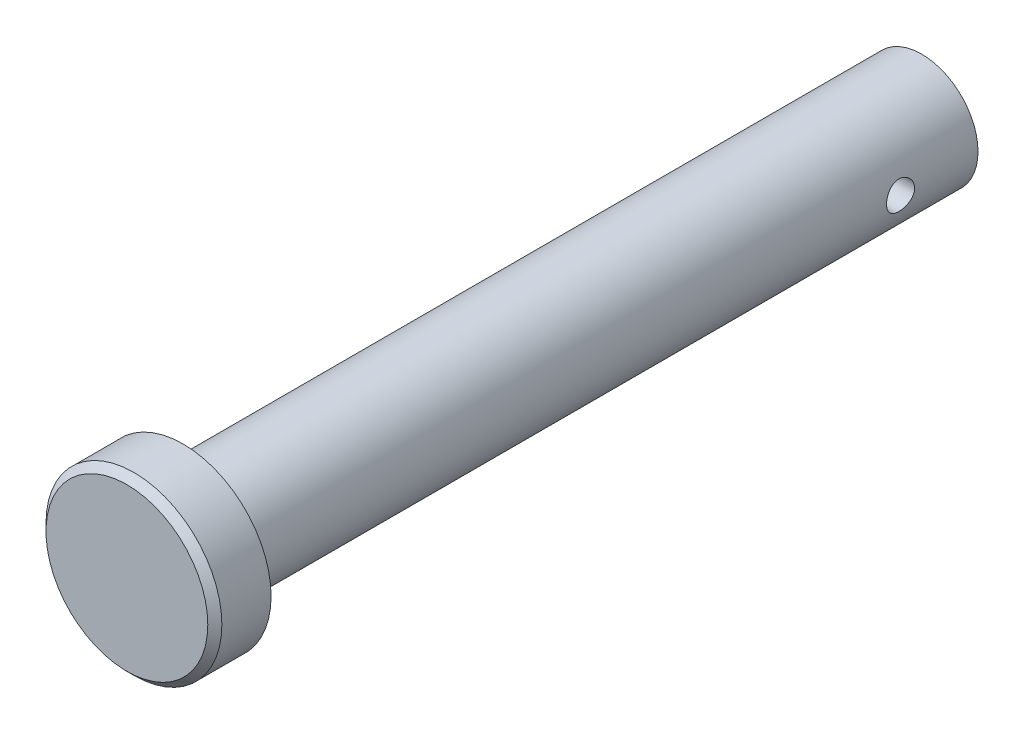
ISO-10303-21;
HEADER;
FILE_DESCRIPTION(('STEP AP214'),'2;1');
FILE_NAME('part.step','',(''),(''),'','','');
FILE_SCHEMA(('AUTOMOTIVE_DESIGN { 1 0 10303 214 1 1 1 1 }'));
ENDSEC;
DATA;
#1=APPLICATION_CONTEXT('core data for automotive mechanical design processes');
#2=APPLICATION_PROTOCOL_DEFINITION('international standard','automotive_design',2000,#1);
#3=PRODUCT_CONTEXT('',#1,'mechanical');
#4=PRODUCT('Part','Part','',(#3));
#5=PRODUCT_RELATED_PRODUCT_CATEGORY('part','',(#4));
#6=PRODUCT_DEFINITION_FORMATION('','',#4);
#7=PRODUCT_DEFINITION_CONTEXT('part definition',#1,'design');
#8=PRODUCT_DEFINITION('design','',#6,#7);
#9=PRODUCT_DEFINITION_SHAPE('','',#8);
#10=(LENGTH_UNIT() NAMED_UNIT(*) SI_UNIT(.MILLI.,.METRE.));
#11=(NAMED_UNIT(*) PLANE_ANGLE_UNIT() SI_UNIT($,.RADIAN.));
#12=(NAMED_UNIT(*) SI_UNIT($,.STERADIAN.) SOLID_ANGLE_UNIT());
#13=UNCERTAINTY_MEASURE_WITH_UNIT(LENGTH_MEASURE(1.E-05),#10,'distance_accuracy_value','');
#14=(GEOMETRIC_REPRESENTATION_CONTEXT(3) GLOBAL_UNCERTAINTY_ASSIGNED_CONTEXT((#13)) GLOBAL_UNIT_ASSIGNED_CONTEXT((#10,
#11,#12)) REPRESENTATION_CONTEXT('',''));
#15=CARTESIAN_POINT('',(0.,0.,0.));
#16=DIRECTION('',(0.,0.,1.));
#17=DIRECTION('',(1.,0.,0.));
#18=AXIS2_PLACEMENT_3D('',#15,#16,#17);
#19=CARTESIAN_POINT('',(0.,0.,105.));
#20=DIRECTION('',(0.,0.,-1.));
#21=DIRECTION('',(-1.,0.,0.));
#22=AXIS2_PLACEMENT_3D('',#19,#20,#21);
#23=CYLINDRICAL_SURFACE('',#22,8.);
#24=CARTESIAN_POINT('',(-8.,0.,13.));
#25=CARTESIAN_POINT('',(-7.9999981315735,-0.110501451559642,12.9999968990158));
#26=CARTESIAN_POINT('',(-7.99768770842435,-0.221037543774351,12.9908112656349));
#27=CARTESIAN_POINT('',(-7.98869485106526,-0.438941765027377,12.954366464924));
#28=CARTESIAN_POINT('',(-7.98200993893301,-0.54630806249432,12.9270970539495));
#29=CARTESIAN_POINT('',(-7.96500835109376,-0.754694496243437,12.8554143287172));
#30=CARTESIAN_POINT('',(-7.95469603789411,-0.855722084573338,12.811021601713));
#31=CARTESIAN_POINT('',(-7.93153791743495,-1.04889617587257,12.7064248132735));
#32=CARTESIAN_POINT('',(-7.91869202472208,-1.14104237913169,12.646220218508));
#33=CARTESIAN_POINT('',(-7.89156551455591,-1.31573590306789,12.5103989471278));
#34=CARTESIAN_POINT('',(-7.87726276197502,-1.39807425341474,12.4345179000546));
#35=CARTESIAN_POINT('',(-7.84898160157248,-1.54899856960443,12.270063726788));
#36=CARTESIAN_POINT('',(-7.83500323053157,-1.61758298259892,12.1814891694041));
#37=CARTESIAN_POINT('',(-7.80873034264225,-1.74003539039863,11.992539697684));
#38=CARTESIAN_POINT('',(-7.79646392619748,-1.79366962123352,11.8920090255884));
#39=CARTESIAN_POINT('',(-7.77532659757355,-1.88319587806766,11.6830021177866));
#40=CARTESIAN_POINT('',(-7.76645514259225,-1.91909074058686,11.5745271555573));
#41=CARTESIAN_POINT('',(-7.7533396892843,-1.97140644907302,11.3550086690644));
#42=CARTESIAN_POINT('',(-7.74900654662681,-1.98820302444274,11.244060138616));
#43=CARTESIAN_POINT('',(-7.74519149946122,-2.00301570008855,11.0208419080009));
#44=CARTESIAN_POINT('',(-7.74570880570571,-2.00103485575749,10.9085724257438));
#45=CARTESIAN_POINT('',(-7.75145607355756,-1.97864869951961,10.6887789230062));
#46=CARTESIAN_POINT('',(-7.75657150676391,-1.95869112025418,10.5812058380462));
#47=CARTESIAN_POINT('',(-7.77075612894758,-1.90163224920399,10.3709852654519));
#48=CARTESIAN_POINT('',(-7.77982559958985,-1.86452973609253,10.2683381292948));
#49=CARTESIAN_POINT('',(-7.80100151874212,-1.77385263724958,10.0696826449972));
#50=CARTESIAN_POINT('',(-7.81313769959755,-1.72011555631056,9.97375177094723));
#51=CARTESIAN_POINT('',(-7.83906281127988,-1.59780836801993,9.7921083869909));
#52=CARTESIAN_POINT('',(-7.85285203112837,-1.52923566507845,9.70639766924366));
#53=CARTESIAN_POINT('',(-7.88101174053188,-1.37688456624163,9.54506184574079));
#54=CARTESIAN_POINT('',(-7.89538759304001,-1.29272834422115,9.46979401325153));
#55=CARTESIAN_POINT('',(-7.92274620771675,-1.11281589000493,9.33437167671479));
#56=CARTESIAN_POINT('',(-7.93572892732543,-1.01705930361059,9.27421763431524));
#57=CARTESIAN_POINT('',(-7.9589030945892,-0.816154518241856,9.17059921836748));
#58=CARTESIAN_POINT('',(-7.96908480170303,-0.710975190944831,9.12719287966076));
#59=CARTESIAN_POINT('',(-7.98543889321888,-0.49450134419051,9.05877692572056));
#60=CARTESIAN_POINT('',(-7.99161204452374,-0.383207998867313,9.03376379144248));
#61=CARTESIAN_POINT('',(-7.999139990285,-0.160719960520035,9.00338991258821));
#62=CARTESIAN_POINT('',(-8.00061404677705,-0.0495956266509458,8.99754263189959));
#63=CARTESIAN_POINT('',(-7.99891739752601,0.172043833068678,9.00433200274064));
#64=CARTESIAN_POINT('',(-7.99574710989128,0.28255901285946,9.01696699039884));
#65=CARTESIAN_POINT('',(-7.98519441503143,0.498152358368656,9.0599612111885));
#66=CARTESIAN_POINT('',(-7.97787512247748,0.603286825291673,9.09005501796931));
#67=CARTESIAN_POINT('',(-7.95984942178845,0.807009723270016,9.16680944537126));
#68=CARTESIAN_POINT('',(-7.94914267159856,0.905597492043513,9.21347173908422));
#69=CARTESIAN_POINT('',(-7.92524410568414,1.0953641792398,9.3229815051663));
#70=CARTESIAN_POINT('',(-7.91201156489243,1.18638058911444,9.38610148319568));
#71=CARTESIAN_POINT('',(-7.88459345583226,1.35670215152433,9.52638654506262));
#72=CARTESIAN_POINT('',(-7.87040772335606,1.43600527863068,9.60355405282254));
#73=CARTESIAN_POINT('',(-7.84225275947695,1.58265409076364,9.77200261445928));
#74=CARTESIAN_POINT('',(-7.82829738916375,1.64965849016271,9.86358360400322));
#75=CARTESIAN_POINT('',(-7.80257171169652,1.7673476786836,10.0569768459543));
#76=CARTESIAN_POINT('',(-7.79080130756035,1.81803319221058,10.1587886439463));
#77=CARTESIAN_POINT('',(-7.77090792979553,1.90126856081239,10.3692076298841));
#78=CARTESIAN_POINT('',(-7.76276340389207,1.93392586220542,10.4777701711253));
#79=CARTESIAN_POINT('',(-7.75102325453578,1.98046087993837,10.6990795171855));
#80=CARTESIAN_POINT('',(-7.74742663626581,1.99434270330488,10.8118254013766));
#81=CARTESIAN_POINT('',(-7.74526534938609,2.00271812044533,11.0348280318069));
#82=CARTESIAN_POINT('',(-7.74655910304351,1.99775719704016,11.145063246833));
#83=CARTESIAN_POINT('',(-7.7537054534379,1.96983637108383,11.3630718515573));
#84=CARTESIAN_POINT('',(-7.75955795855809,1.94687683024903,11.4708452906849));
#85=CARTESIAN_POINT('',(-7.77508347576963,1.88390842592373,11.6802779454205));
#86=CARTESIAN_POINT('',(-7.78473353648412,1.84400187290717,11.7819697403203));
#87=CARTESIAN_POINT('',(-7.80677007633105,1.7483532181401,11.9772871769516));
#88=CARTESIAN_POINT('',(-7.81915693494364,1.69260892004559,12.0709116975826));
#89=CARTESIAN_POINT('',(-7.84567512351349,1.56515699818285,12.2500728386694));
#90=CARTESIAN_POINT('',(-7.85984353109009,1.49307088388301,12.3353347645653));
#91=CARTESIAN_POINT('',(-7.88810702995047,1.33571916158632,12.4927293930605));
#92=CARTESIAN_POINT('',(-7.90220210302746,1.2504504283482,12.564858973484));
#93=CARTESIAN_POINT('',(-7.92903540863551,1.06729011560346,12.6952150780861));
#94=CARTESIAN_POINT('',(-7.94174444487824,0.969197896421852,12.7531661515621));
#95=CARTESIAN_POINT('',(-7.96406566633491,0.76435474601397,12.8516632839207));
#96=CARTESIAN_POINT('',(-7.97368006933042,0.657610084582321,12.892221814198));
#97=CARTESIAN_POINT('',(-7.98730746087389,0.459213670991297,12.9487624404395));
#98=CARTESIAN_POINT('',(-7.9920344673692,0.368506894544093,12.9679349907379));
#99=CARTESIAN_POINT('',(-7.99838140309264,0.185208095381712,12.9935545914959));
#100=CARTESIAN_POINT('',(-8.00000156601192,0.0926162149901555,13.0000025990737));
#101=CARTESIAN_POINT('',(-8.,0.,13.));
#102=B_SPLINE_CURVE_WITH_KNOTS('',3,(#24,#25,#26,#27,#28,#29,#30,#31,#32,#33,#34,#35,#36,#37,
#38,#39,#40,#41,#42,#43,#44,#45,#46,#47,#48,#49,#50,#51,#52,#53,#54,#55,#56,#57,#58,#59,#60,#61,
#62,#63,#64,#65,#66,#67,#68,#69,#70,#71,#72,#73,#74,#75,#76,#77,#78,#79,#80,#81,#82,#83,#84,#85,
#86,#87,#88,#89,#90,#91,#92,#93,#94,#95,#96,#97,#98,#99,#100,#101),.UNSPECIFIED.,.T.,.F.,(4,2,2,
2,2,2,2,2,2,2,2,2,2,2,2,2,2,2,2,2,2,2,2,2,2,2,2,2,2,2,2,2,2,2,2,2,2,2,4),(0.,0.33116494996252,
0.662517650351867,0.993473203048143,1.32443992022577,1.66152580582852,1.99864972773416,
2.34078196727743,2.68285948225825,3.01808393468094,3.35325384154691,3.68029996013785,
4.00736937959146,4.337740371696,4.66816921119312,5.00802001296454,5.34788119415425,
5.6889097201658,6.02987298255952,6.36211078603464,6.69431868154752,7.02160366023145,
7.34892169767482,7.68204783424898,8.01523150681787,8.35659345610397,8.69794025003773,
9.03723006156477,9.37644564340973,9.70591707202579,10.0353818794581,10.3628853408369,
10.6904342418696,11.0265276855098,11.3627009303165,11.7049624733721,12.046978184329,
12.3245632392729,12.6021274139515),.UNSPECIFIED.);
#103=CARTESIAN_POINT('',(-8.,0.,13.));
#104=VERTEX_POINT('',#103);
#105=EDGE_CURVE('E44',#104,#104,#102,.T.);
#106=ORIENTED_EDGE('',*,*,#105,.T.);
#107=EDGE_LOOP('',(#106));
#108=FACE_BOUND('',#107,.T.);
#109=CARTESIAN_POINT('',(8.,0.,8.99999999999999));
#110=CARTESIAN_POINT('',(7.9999981315735,-0.110501451559642,9.0000031009842));
#111=CARTESIAN_POINT('',(7.99768770842435,-0.221037543774351,9.00918873436504));
#112=CARTESIAN_POINT('',(7.98869485106526,-0.438941765027377,9.045633535076));
#113=CARTESIAN_POINT('',(7.98200993893301,-0.54630806249432,9.07290294605046));
#114=CARTESIAN_POINT('',(7.96500835109376,-0.754694496243437,9.14458567128277));
#115=CARTESIAN_POINT('',(7.95469603789411,-0.855722084573338,9.18897839828702));
#116=CARTESIAN_POINT('',(7.93153791743495,-1.04889617587257,9.29357518672645));
#117=CARTESIAN_POINT('',(7.91869202472208,-1.14104237913169,9.35377978149195));
#118=CARTESIAN_POINT('',(7.89156551455591,-1.31573590306789,9.48960105287223));
#119=CARTESIAN_POINT('',(7.87726276197502,-1.39807425341474,9.56548209994541));
#120=CARTESIAN_POINT('',(7.84898160157248,-1.54899856960443,9.72993627321204));
#121=CARTESIAN_POINT('',(7.83500323053157,-1.61758298259892,9.81851083059591));
#122=CARTESIAN_POINT('',(7.80873034264225,-1.74003539039863,10.007460302316));
#123=CARTESIAN_POINT('',(7.79646392619748,-1.79366962123352,10.1079909744116));
#124=CARTESIAN_POINT('',(7.77532659757355,-1.88319587806766,10.3169978822134));
#125=CARTESIAN_POINT('',(7.76645514259225,-1.91909074058686,10.4254728444427));
#126=CARTESIAN_POINT('',(7.7533396892843,-1.97140644907302,10.6449913309355));
#127=CARTESIAN_POINT('',(7.74900654662681,-1.98820302444274,10.755939861384));
#128=CARTESIAN_POINT('',(7.74519149946122,-2.00301570008855,10.9791580919991));
#129=CARTESIAN_POINT('',(7.74570880570571,-2.00103485575749,11.0914275742562));
#130=CARTESIAN_POINT('',(7.75145607355756,-1.97864869951961,11.3112210769938));
#131=CARTESIAN_POINT('',(7.75657150676391,-1.95869112025418,11.4187941619538));
#132=CARTESIAN_POINT('',(7.77075612894758,-1.90163224920399,11.6290147345481));
#133=CARTESIAN_POINT('',(7.77982559958985,-1.86452973609253,11.7316618707052));
#134=CARTESIAN_POINT('',(7.80100151874212,-1.77385263724958,11.9303173550028));
#135=CARTESIAN_POINT('',(7.81313769959755,-1.72011555631056,12.0262482290528));
#136=CARTESIAN_POINT('',(7.83906281127988,-1.59780836801993,12.2078916130091));
#137=CARTESIAN_POINT('',(7.85285203112837,-1.52923566507845,12.2936023307563));
#138=CARTESIAN_POINT('',(7.88101174053188,-1.37688456624163,12.4549381542592));
#139=CARTESIAN_POINT('',(7.89538759304001,-1.29272834422115,12.5302059867485));
#140=CARTESIAN_POINT('',(7.92274620771675,-1.11281589000493,12.6656283232852));
#141=CARTESIAN_POINT('',(7.93572892732543,-1.01705930361059,12.7257823656848));
#142=CARTESIAN_POINT('',(7.9589030945892,-0.816154518241856,12.8294007816325));
#143=CARTESIAN_POINT('',(7.96908480170303,-0.710975190944831,12.8728071203392));
#144=CARTESIAN_POINT('',(7.98543889321888,-0.49450134419051,12.9412230742794));
#145=CARTESIAN_POINT('',(7.99161204452374,-0.383207998867313,12.9662362085575));
#146=CARTESIAN_POINT('',(7.999139990285,-0.160719960520035,12.9966100874118));
#147=CARTESIAN_POINT('',(8.00061404677705,-0.0495956266509458,13.0024573681004));
#148=CARTESIAN_POINT('',(7.99891739752601,0.172043833068678,12.9956679972593));
#149=CARTESIAN_POINT('',(7.99574710989128,0.28255901285946,12.9830330096012));
#150=CARTESIAN_POINT('',(7.98519441503143,0.498152358368656,12.9400387888115));
#151=CARTESIAN_POINT('',(7.97787512247748,0.603286825291674,12.9099449820307));
#152=CARTESIAN_POINT('',(7.95984942178845,0.807009723270016,12.8331905546287));
#153=CARTESIAN_POINT('',(7.94914267159856,0.905597492043513,12.7865282609158));
#154=CARTESIAN_POINT('',(7.92524410568414,1.0953641792398,12.6770184948337));
#155=CARTESIAN_POINT('',(7.91201156489243,1.18638058911444,12.6138985168043));
#156=CARTESIAN_POINT('',(7.88459345583226,1.35670215152433,12.4736134549374));
#157=CARTESIAN_POINT('',(7.87040772335606,1.43600527863068,12.3964459471775));
#158=CARTESIAN_POINT('',(7.84225275947695,1.58265409076364,12.2279973855407));
#159=CARTESIAN_POINT('',(7.82829738916375,1.64965849016271,12.1364163959968));
#160=CARTESIAN_POINT('',(7.80257171169652,1.7673476786836,11.9430231540457));
#161=CARTESIAN_POINT('',(7.79080130756035,1.81803319221058,11.8412113560537));
#162=CARTESIAN_POINT('',(7.77090792979553,1.90126856081239,11.6307923701159));
#163=CARTESIAN_POINT('',(7.76276340389207,1.93392586220542,11.5222298288747));
#164=CARTESIAN_POINT('',(7.75102325453578,1.98046087993837,11.3009204828145));
#165=CARTESIAN_POINT('',(7.74742663626581,1.99434270330488,11.1881745986233));
#166=CARTESIAN_POINT('',(7.74526534938609,2.00271812044533,10.9651719681931));
#167=CARTESIAN_POINT('',(7.74655910304351,1.99775719704016,10.854936753167));
#168=CARTESIAN_POINT('',(7.7537054534379,1.96983637108383,10.6369281484427));
#169=CARTESIAN_POINT('',(7.75955795855809,1.94687683024903,10.5291547093151));
#170=CARTESIAN_POINT('',(7.77508347576963,1.88390842592373,10.3197220545795));
#171=CARTESIAN_POINT('',(7.78473353648412,1.84400187290717,10.2180302596797));
#172=CARTESIAN_POINT('',(7.80677007633105,1.7483532181401,10.0227128230484));
#173=CARTESIAN_POINT('',(7.81915693494364,1.69260892004559,9.92908830241744));
#174=CARTESIAN_POINT('',(7.84567512351349,1.56515699818285,9.74992716133063));
#175=CARTESIAN_POINT('',(7.85984353109009,1.49307088388301,9.66466523543472));
#176=CARTESIAN_POINT('',(7.88810702995047,1.33571916158632,9.50727060693945));
#177=CARTESIAN_POINT('',(7.90220210302746,1.2504504283482,9.43514102651604));
#178=CARTESIAN_POINT('',(7.92903540863551,1.06729011560346,9.30478492191385));
#179=CARTESIAN_POINT('',(7.94174444487824,0.969197896421852,9.24683384843789));
#180=CARTESIAN_POINT('',(7.96406566633491,0.764354746013971,9.14833671607929));
#181=CARTESIAN_POINT('',(7.97368006933042,0.657610084582321,9.10777818580195));
#182=CARTESIAN_POINT('',(7.98730746087389,0.459213670991297,9.05123755956046));
#183=CARTESIAN_POINT('',(7.9920344673692,0.368506894544093,9.03206500926208));
#184=CARTESIAN_POINT('',(7.99838140309264,0.185208095381712,9.00644540850407));
#185=CARTESIAN_POINT('',(8.00000156601192,0.0926162149901555,8.99999740092626));
#186=CARTESIAN_POINT('',(8.,0.,8.99999999999999));
#187=B_SPLINE_CURVE_WITH_KNOTS('',3,(#109,#110,#111,#112,#113,#114,#115,#116,#117,#118,#119,
#120,#121,#122,#123,#124,#125,#126,#127,#128,#129,#130,#131,#132,#133,#134,#135,#136,#137,#138,
#139,#140,#141,#142,#143,#144,#145,#146,#147,#148,#149,#150,#151,#152,#153,#154,#155,#156,#157,
#158,#159,#160,#161,#162,#163,#164,#165,#166,#167,#168,#169,#170,#171,#172,#173,#174,#175,#176,
#177,#178,#179,#180,#181,#182,#183,#184,#185,#186),.UNSPECIFIED.,.T.,.F.,(4,2,2,2,2,2,2,2,2,2,2,
2,2,2,2,2,2,2,2,2,2,2,2,2,2,2,2,2,2,2,2,2,2,2,2,2,2,2,4),(0.,0.33116494996252,0.662517650351867,
0.993473203048143,1.32443992022577,1.66152580582852,1.99864972773416,2.34078196727743,
2.68285948225825,3.01808393468094,3.35325384154691,3.68029996013785,4.00736937959146,
4.337740371696,4.66816921119312,5.00802001296454,5.34788119415425,5.68890972016581,
6.02987298255952,6.36211078603464,6.69431868154752,7.02160366023145,7.34892169767483,
7.68204783424898,8.01523150681787,8.35659345610396,8.69794025003773,9.03723006156477,
9.37644564340973,9.70591707202579,10.0353818794581,10.3628853408369,10.6904342418696,
11.0265276855098,11.3627009303165,11.7049624733721,12.046978184329,12.3245632392729,
12.6021274139515),.UNSPECIFIED.);
#188=CARTESIAN_POINT('',(8.,0.,8.99999999999999));
#189=VERTEX_POINT('',#188);
#190=EDGE_CURVE('E62',#189,#189,#187,.T.);
#191=ORIENTED_EDGE('',*,*,#190,.T.);
#192=EDGE_LOOP('',(#191));
#193=FACE_BOUND('',#192,.T.);
#194=CARTESIAN_POINT('',(0.,0.,105.));
#195=DIRECTION('',(0.,0.,1.));
#196=DIRECTION('',(1.,0.,0.));
#197=AXIS2_PLACEMENT_3D('',#194,#195,#196);
#198=CIRCLE('',#197,8.);
#199=CARTESIAN_POINT('',(8.,0.,105.));
#200=VERTEX_POINT('',#199);
#201=EDGE_CURVE('E59',#200,#200,#198,.T.);
#202=ORIENTED_EDGE('',*,*,#201,.F.);
#203=EDGE_LOOP('',(#202));
#204=FACE_BOUND('',#203,.T.);
#205=CARTESIAN_POINT('',(0.,0.,0.));
#206=DIRECTION('',(0.,0.,1.));
#207=DIRECTION('',(1.,0.,0.));
#208=AXIS2_PLACEMENT_3D('',#205,#206,#207);
#209=CIRCLE('',#208,8.);
#210=CARTESIAN_POINT('',(8.,0.,0.));
#211=VERTEX_POINT('',#210);
#212=EDGE_CURVE('E95',#211,#211,#209,.T.);
#213=ORIENTED_EDGE('',*,*,#212,.T.);
#214=EDGE_LOOP('',(#213));
#215=FACE_BOUND('',#214,.T.);
#216=ADVANCED_FACE('F39',(#108,#193,#204,#215),#23,.T.);
#217=CARTESIAN_POINT('',(0.,0.,0.));
#218=DIRECTION('',(0.,0.,1.));
#219=DIRECTION('',(1.,0.,0.));
#220=AXIS2_PLACEMENT_3D('',#217,#218,#219);
#221=PLANE('',#220);
#222=ORIENTED_EDGE('',*,*,#212,.F.);
#223=EDGE_LOOP('',(#222));
#224=FACE_BOUND('',#223,.T.);
#225=ADVANCED_FACE('F86',(#224),#221,.F.);
#226=CARTESIAN_POINT('',(0.,0.,113.));
#227=DIRECTION('',(0.,0.,-1.));
#228=DIRECTION('',(-1.,0.,0.));
#229=AXIS2_PLACEMENT_3D('',#226,#227,#228);
#230=CYLINDRICAL_SURFACE('',#229,12.5);
#231=CARTESIAN_POINT('',(0.,0.,112.));
#232=DIRECTION('',(0.,0.,1.));
#233=DIRECTION('',(1.,0.,0.));
#234=AXIS2_PLACEMENT_3D('',#231,#232,#233);
#235=CIRCLE('',#234,12.5);
#236=CARTESIAN_POINT('',(12.5,0.,112.));
#237=VERTEX_POINT('',#236);
#238=EDGE_CURVE('E10',#237,#237,#235,.F.);
#239=ORIENTED_EDGE('',*,*,#238,.T.);
#240=EDGE_LOOP('',(#239));
#241=FACE_BOUND('',#240,.T.);
#242=CARTESIAN_POINT('',(0.,0.,105.));
#243=DIRECTION('',(0.,0.,1.));
#244=DIRECTION('',(1.,0.,0.));
#245=AXIS2_PLACEMENT_3D('',#242,#243,#244);
#246=CIRCLE('',#245,12.5);
#247=CARTESIAN_POINT('',(12.5,0.,105.));
#248=VERTEX_POINT('',#247);
#249=EDGE_CURVE('E98',#248,#248,#246,.T.);
#250=ORIENTED_EDGE('',*,*,#249,.T.);
#251=EDGE_LOOP('',(#250));
#252=FACE_BOUND('',#251,.T.);
#253=ADVANCED_FACE('F80',(#241,#252),#230,.T.);
#254=CARTESIAN_POINT('',(0.,0.,113.));
#255=DIRECTION('',(0.,0.,1.));
#256=DIRECTION('',(1.,0.,0.));
#257=AXIS2_PLACEMENT_3D('',#254,#255,#256);
#258=PLANE('',#257);
#259=CARTESIAN_POINT('',(0.,0.,113.));
#260=DIRECTION('',(0.,0.,1.));
#261=DIRECTION('',(1.,0.,0.));
#262=AXIS2_PLACEMENT_3D('',#259,#260,#261);
#263=CIRCLE('',#262,11.5);
#264=CARTESIAN_POINT('',(11.5,0.,113.));
#265=VERTEX_POINT('',#264);
#266=EDGE_CURVE('E53',#265,#265,#263,.T.);
#267=ORIENTED_EDGE('',*,*,#266,.T.);
#268=EDGE_LOOP('',(#267));
#269=FACE_BOUND('',#268,.T.);
#270=ADVANCED_FACE('F75',(#269),#258,.T.);
#271=CARTESIAN_POINT('',(0.,0.,105.));
#272=DIRECTION('',(0.,0.,1.));
#273=DIRECTION('',(1.,0.,0.));
#274=AXIS2_PLACEMENT_3D('',#271,#272,#273);
#275=PLANE('',#274);
#276=ORIENTED_EDGE('',*,*,#201,.T.);
#277=EDGE_LOOP('',(#276));
#278=FACE_BOUND('',#277,.T.);
#279=ORIENTED_EDGE('',*,*,#249,.F.);
#280=EDGE_LOOP('',(#279));
#281=FACE_BOUND('',#280,.T.);
#282=ADVANCED_FACE('F79',(#278,#281),#275,.F.);
#283=CARTESIAN_POINT('',(0.,0.,113.));
#284=DIRECTION('',(0.,0.,-1.));
#285=DIRECTION('',(-1.,0.,0.));
#286=AXIS2_PLACEMENT_3D('',#283,#284,#285);
#287=CONICAL_SURFACE('',#286,11.5,0.78539816339745);
#288=ORIENTED_EDGE('',*,*,#238,.F.);
#289=EDGE_LOOP('',(#288));
#290=FACE_BOUND('',#289,.T.);
#291=ORIENTED_EDGE('',*,*,#266,.F.);
#292=EDGE_LOOP('',(#291));
#293=FACE_BOUND('',#292,.T.);
#294=ADVANCED_FACE('F42',(#290,#293),#287,.T.);
#295=CARTESIAN_POINT('',(-500.,0.,11.));
#296=DIRECTION('',(1.,0.,0.));
#297=DIRECTION('',(0.,0.,-1.));
#298=AXIS2_PLACEMENT_3D('',#295,#296,#297);
#299=CYLINDRICAL_SURFACE('',#298,2.);
#300=ORIENTED_EDGE('',*,*,#190,.F.);
#301=EDGE_LOOP('',(#300));
#302=FACE_BOUND('',#301,.T.);
#303=ORIENTED_EDGE('',*,*,#105,.F.);
#304=EDGE_LOOP('',(#303));
#305=FACE_BOUND('',#304,.T.);
#306=ADVANCED_FACE('F70',(#302,#305),#299,.F.);
#307=CLOSED_SHELL('',(#216,#225,#253,#270,#282,#294,#306));
#308=MANIFOLD_SOLID_BREP('B2',#307);
#309=ADVANCED_BREP_SHAPE_REPRESENTATION('',(#18,#308),#14);
#310=SHAPE_DEFINITION_REPRESENTATION(#9,#309);
ENDSEC;
END-ISO-10303-21;
